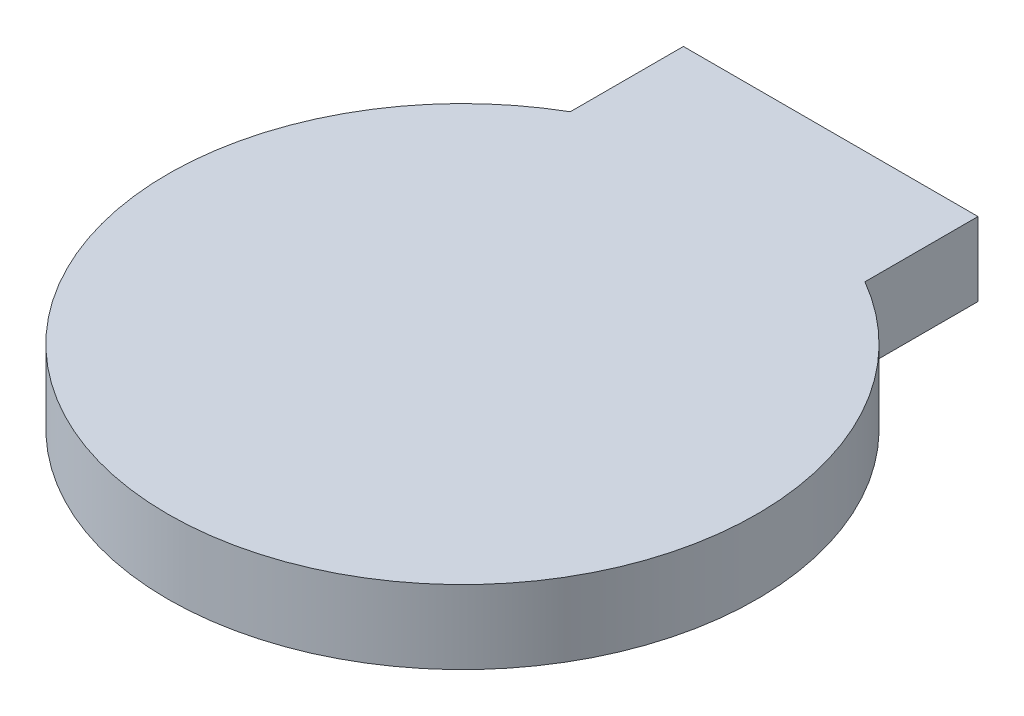
ISO-10303-21;
HEADER;
FILE_DESCRIPTION(('STEP AP214'),'2;1');
FILE_NAME('part.step','',(''),(''),'','','');
FILE_SCHEMA(('AUTOMOTIVE_DESIGN { 1 0 10303 214 1 1 1 1 }'));
ENDSEC;
DATA;
#1=APPLICATION_CONTEXT('core data for automotive mechanical design processes');
#2=APPLICATION_PROTOCOL_DEFINITION('international standard','automotive_design',2000,#1);
#3=PRODUCT_CONTEXT('',#1,'mechanical');
#4=PRODUCT('Part','Part','',(#3));
#5=PRODUCT_RELATED_PRODUCT_CATEGORY('part','',(#4));
#6=PRODUCT_DEFINITION_FORMATION('','',#4);
#7=PRODUCT_DEFINITION_CONTEXT('part definition',#1,'design');
#8=PRODUCT_DEFINITION('design','',#6,#7);
#9=PRODUCT_DEFINITION_SHAPE('','',#8);
#10=(LENGTH_UNIT() NAMED_UNIT(*) SI_UNIT(.MILLI.,.METRE.));
#11=(NAMED_UNIT(*) PLANE_ANGLE_UNIT() SI_UNIT($,.RADIAN.));
#12=(NAMED_UNIT(*) SI_UNIT($,.STERADIAN.) SOLID_ANGLE_UNIT());
#13=UNCERTAINTY_MEASURE_WITH_UNIT(LENGTH_MEASURE(1.E-05),#10,'distance_accuracy_value','');
#14=(GEOMETRIC_REPRESENTATION_CONTEXT(3) GLOBAL_UNCERTAINTY_ASSIGNED_CONTEXT((#13)) GLOBAL_UNIT_ASSIGNED_CONTEXT((#10,
#11,#12)) REPRESENTATION_CONTEXT('',''));
#15=CARTESIAN_POINT('',(0.,0.,0.));
#16=DIRECTION('',(0.,0.,1.));
#17=DIRECTION('',(1.,0.,0.));
#18=AXIS2_PLACEMENT_3D('',#15,#16,#17);
#19=CARTESIAN_POINT('',(-6.,3.,-15.));
#20=DIRECTION('',(1.,0.,0.));
#21=DIRECTION('',(0.,0.,-1.));
#22=AXIS2_PLACEMENT_3D('',#19,#20,#21);
#23=PLANE('',#22);
#24=DIRECTION('',(0.,0.,1.));
#25=VECTOR('',#24,1.);
#26=CARTESIAN_POINT('',(-6.,0.,-15.));
#27=LINE('',#26,#25);
#28=CARTESIAN_POINT('',(-6.,0.,-15.));
#29=VERTEX_POINT('',#28);
#30=CARTESIAN_POINT('',(-6.,0.,-10.3923048454133));
#31=VERTEX_POINT('',#30);
#32=EDGE_CURVE('E107',#29,#31,#27,.T.);
#33=ORIENTED_EDGE('',*,*,#32,.T.);
#34=DIRECTION('',(0.,-1.,0.));
#35=VECTOR('',#34,1.);
#36=CARTESIAN_POINT('',(-6.,3.,-10.3923048454133));
#37=LINE('',#36,#35);
#38=CARTESIAN_POINT('',(-6.,3.,-10.3923048454133));
#39=VERTEX_POINT('',#38);
#40=EDGE_CURVE('E11',#39,#31,#37,.T.);
#41=ORIENTED_EDGE('',*,*,#40,.F.);
#42=DIRECTION('',(0.,0.,1.));
#43=VECTOR('',#42,1.);
#44=CARTESIAN_POINT('',(-6.,3.,-15.));
#45=LINE('',#44,#43);
#46=CARTESIAN_POINT('',(-6.,3.,-15.));
#47=VERTEX_POINT('',#46);
#48=EDGE_CURVE('E91',#47,#39,#45,.T.);
#49=ORIENTED_EDGE('',*,*,#48,.F.);
#50=DIRECTION('',(0.,-1.,0.));
#51=VECTOR('',#50,1.);
#52=CARTESIAN_POINT('',(-6.,3.,-15.));
#53=LINE('',#52,#51);
#54=EDGE_CURVE('E103',#47,#29,#53,.T.);
#55=ORIENTED_EDGE('',*,*,#54,.T.);
#56=EDGE_LOOP('',(#33,#41,#49,#55));
#57=FACE_BOUND('',#56,.T.);
#58=ADVANCED_FACE('F39',(#57),#23,.F.);
#59=CARTESIAN_POINT('',(0.,3.,0.));
#60=DIRECTION('',(0.,-1.,0.));
#61=DIRECTION('',(0.,0.,-1.));
#62=AXIS2_PLACEMENT_3D('',#59,#60,#61);
#63=CYLINDRICAL_SURFACE('',#62,12.);
#64=CARTESIAN_POINT('',(0.,0.,0.));
#65=DIRECTION('',(0.,1.,0.));
#66=DIRECTION('',(0.,0.,1.));
#67=AXIS2_PLACEMENT_3D('',#64,#65,#66);
#68=CIRCLE('',#67,12.);
#69=CARTESIAN_POINT('',(6.,0.,-10.3923048454133));
#70=VERTEX_POINT('',#69);
#71=EDGE_CURVE('E96',#31,#70,#68,.T.);
#72=ORIENTED_EDGE('',*,*,#71,.T.);
#73=DIRECTION('',(0.,-1.,0.));
#74=VECTOR('',#73,1.);
#75=CARTESIAN_POINT('',(6.,3.,-10.3923048454133));
#76=LINE('',#75,#74);
#77=CARTESIAN_POINT('',(6.,3.,-10.3923048454133));
#78=VERTEX_POINT('',#77);
#79=EDGE_CURVE('E48',#78,#70,#76,.T.);
#80=ORIENTED_EDGE('',*,*,#79,.F.);
#81=CARTESIAN_POINT('',(0.,3.,0.));
#82=DIRECTION('',(0.,1.,0.));
#83=DIRECTION('',(0.,0.,1.));
#84=AXIS2_PLACEMENT_3D('',#81,#82,#83);
#85=CIRCLE('',#84,12.);
#86=EDGE_CURVE('E86',#39,#78,#85,.T.);
#87=ORIENTED_EDGE('',*,*,#86,.F.);
#88=ORIENTED_EDGE('',*,*,#40,.T.);
#89=EDGE_LOOP('',(#72,#80,#87,#88));
#90=FACE_BOUND('',#89,.T.);
#91=ADVANCED_FACE('F95',(#90),#63,.T.);
#92=CARTESIAN_POINT('',(6.,3.,-15.));
#93=DIRECTION('',(-1.,0.,0.));
#94=DIRECTION('',(0.,0.,1.));
#95=AXIS2_PLACEMENT_3D('',#92,#93,#94);
#96=PLANE('',#95);
#97=DIRECTION('',(0.,0.,-1.));
#98=VECTOR('',#97,1.);
#99=CARTESIAN_POINT('',(6.,0.,-15.));
#100=LINE('',#99,#98);
#101=CARTESIAN_POINT('',(6.,0.,-15.));
#102=VERTEX_POINT('',#101);
#103=EDGE_CURVE('E73',#70,#102,#100,.T.);
#104=ORIENTED_EDGE('',*,*,#103,.T.);
#105=DIRECTION('',(0.,-1.,0.));
#106=VECTOR('',#105,1.);
#107=CARTESIAN_POINT('',(6.,3.,-15.));
#108=LINE('',#107,#106);
#109=CARTESIAN_POINT('',(6.,3.,-15.));
#110=VERTEX_POINT('',#109);
#111=EDGE_CURVE('E98',#110,#102,#108,.T.);
#112=ORIENTED_EDGE('',*,*,#111,.F.);
#113=DIRECTION('',(0.,0.,-1.));
#114=VECTOR('',#113,1.);
#115=CARTESIAN_POINT('',(6.,3.,-15.));
#116=LINE('',#115,#114);
#117=EDGE_CURVE('E89',#78,#110,#116,.T.);
#118=ORIENTED_EDGE('',*,*,#117,.F.);
#119=ORIENTED_EDGE('',*,*,#79,.T.);
#120=EDGE_LOOP('',(#104,#112,#118,#119));
#121=FACE_BOUND('',#120,.T.);
#122=ADVANCED_FACE('F99',(#121),#96,.F.);
#123=CARTESIAN_POINT('',(-6.,3.,-15.));
#124=DIRECTION('',(0.,0.,1.));
#125=DIRECTION('',(1.,0.,0.));
#126=AXIS2_PLACEMENT_3D('',#123,#124,#125);
#127=PLANE('',#126);
#128=DIRECTION('',(-1.,0.,0.));
#129=VECTOR('',#128,1.);
#130=CARTESIAN_POINT('',(-6.,0.,-15.));
#131=LINE('',#130,#129);
#132=EDGE_CURVE('E79',#102,#29,#131,.T.);
#133=ORIENTED_EDGE('',*,*,#132,.T.);
#134=ORIENTED_EDGE('',*,*,#54,.F.);
#135=DIRECTION('',(-1.,0.,0.));
#136=VECTOR('',#135,1.);
#137=CARTESIAN_POINT('',(-6.,3.,-15.));
#138=LINE('',#137,#136);
#139=EDGE_CURVE('E56',#110,#47,#138,.T.);
#140=ORIENTED_EDGE('',*,*,#139,.F.);
#141=ORIENTED_EDGE('',*,*,#111,.T.);
#142=EDGE_LOOP('',(#133,#134,#140,#141));
#143=FACE_BOUND('',#142,.T.);
#144=ADVANCED_FACE('F120',(#143),#127,.F.);
#145=CARTESIAN_POINT('',(0.,3.,0.));
#146=DIRECTION('',(0.,1.,0.));
#147=DIRECTION('',(0.,0.,1.));
#148=AXIS2_PLACEMENT_3D('',#145,#146,#147);
#149=PLANE('',#148);
#150=ORIENTED_EDGE('',*,*,#48,.T.);
#151=ORIENTED_EDGE('',*,*,#86,.T.);
#152=ORIENTED_EDGE('',*,*,#117,.T.);
#153=ORIENTED_EDGE('',*,*,#139,.T.);
#154=EDGE_LOOP('',(#150,#151,#152,#153));
#155=FACE_BOUND('',#154,.T.);
#156=ADVANCED_FACE('F87',(#155),#149,.T.);
#157=CARTESIAN_POINT('',(0.,0.,0.));
#158=DIRECTION('',(0.,1.,0.));
#159=DIRECTION('',(0.,0.,1.));
#160=AXIS2_PLACEMENT_3D('',#157,#158,#159);
#161=PLANE('',#160);
#162=ORIENTED_EDGE('',*,*,#32,.F.);
#163=ORIENTED_EDGE('',*,*,#132,.F.);
#164=ORIENTED_EDGE('',*,*,#103,.F.);
#165=ORIENTED_EDGE('',*,*,#71,.F.);
#166=EDGE_LOOP('',(#162,#163,#164,#165));
#167=FACE_BOUND('',#166,.T.);
#168=ADVANCED_FACE('F123',(#167),#161,.F.);
#169=CLOSED_SHELL('',(#58,#91,#122,#144,#156,#168));
#170=MANIFOLD_SOLID_BREP('B2',#169);
#171=ADVANCED_BREP_SHAPE_REPRESENTATION('',(#18,#170),#14);
#172=SHAPE_DEFINITION_REPRESENTATION(#9,#171);
ENDSEC;
END-ISO-10303-21;
